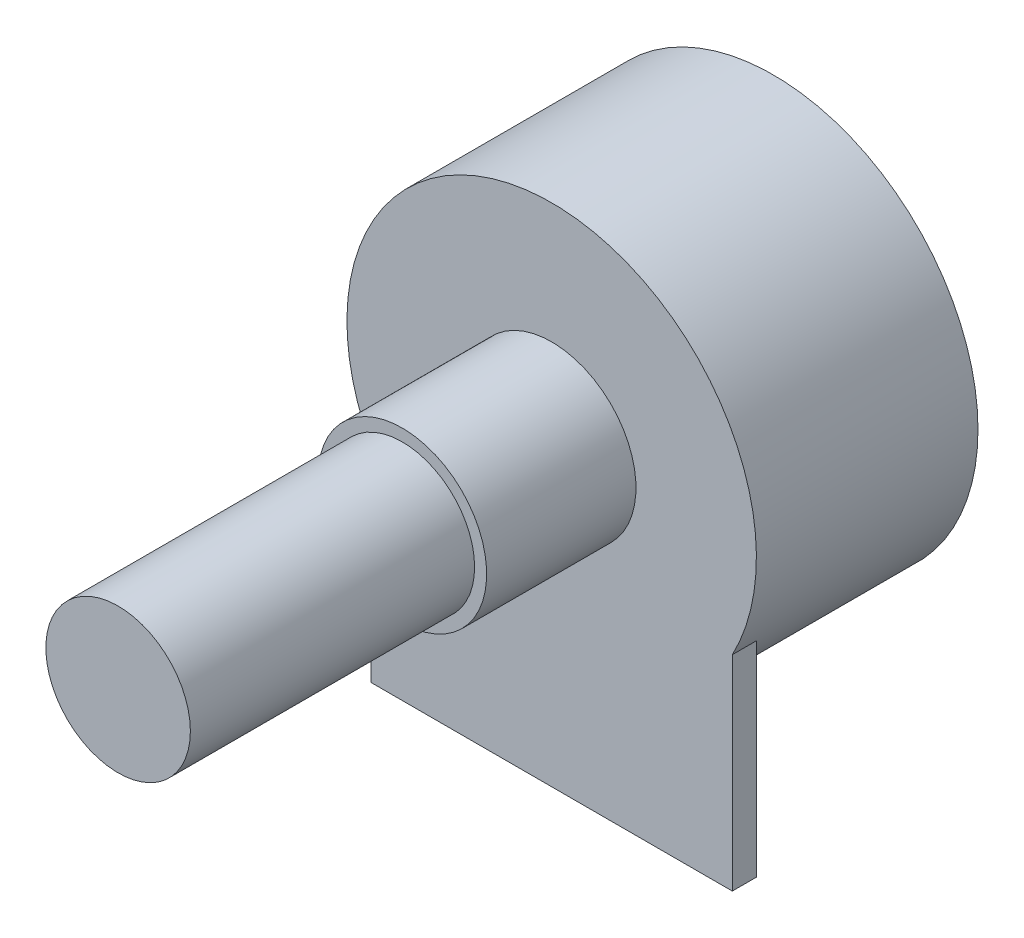
ISO-10303-21;
HEADER;
FILE_DESCRIPTION(('STEP AP214'),'2;1');
FILE_NAME('part.step','',(''),(''),'','','');
FILE_SCHEMA(('AUTOMOTIVE_DESIGN { 1 0 10303 214 1 1 1 1 }'));
ENDSEC;
DATA;
#1=APPLICATION_CONTEXT('core data for automotive mechanical design processes');
#2=APPLICATION_PROTOCOL_DEFINITION('international standard','automotive_design',2000,#1);
#3=PRODUCT_CONTEXT('',#1,'mechanical');
#4=PRODUCT('Part','Part','',(#3));
#5=PRODUCT_RELATED_PRODUCT_CATEGORY('part','',(#4));
#6=PRODUCT_DEFINITION_FORMATION('','',#4);
#7=PRODUCT_DEFINITION_CONTEXT('part definition',#1,'design');
#8=PRODUCT_DEFINITION('design','',#6,#7);
#9=PRODUCT_DEFINITION_SHAPE('','',#8);
#10=(LENGTH_UNIT() NAMED_UNIT(*) SI_UNIT(.MILLI.,.METRE.));
#11=(NAMED_UNIT(*) PLANE_ANGLE_UNIT() SI_UNIT($,.RADIAN.));
#12=(NAMED_UNIT(*) SI_UNIT($,.STERADIAN.) SOLID_ANGLE_UNIT());
#13=UNCERTAINTY_MEASURE_WITH_UNIT(LENGTH_MEASURE(1.E-05),#10,'distance_accuracy_value','');
#14=(GEOMETRIC_REPRESENTATION_CONTEXT(3) GLOBAL_UNCERTAINTY_ASSIGNED_CONTEXT((#13)) GLOBAL_UNIT_ASSIGNED_CONTEXT((#10,
#11,#12)) REPRESENTATION_CONTEXT('',''));
#15=CARTESIAN_POINT('',(0.,0.,0.));
#16=DIRECTION('',(0.,0.,1.));
#17=DIRECTION('',(1.,0.,0.));
#18=AXIS2_PLACEMENT_3D('',#15,#16,#17);
#19=CARTESIAN_POINT('',(0.,0.,9.2));
#20=DIRECTION('',(0.,0.,-1.));
#21=DIRECTION('',(-1.,0.,0.));
#22=AXIS2_PLACEMENT_3D('',#19,#20,#21);
#23=CYLINDRICAL_SURFACE('',#22,8.5);
#24=CARTESIAN_POINT('',(0.,0.,8.2));
#25=DIRECTION('',(0.,0.,1.));
#26=DIRECTION('',(1.,0.,0.));
#27=AXIS2_PLACEMENT_3D('',#24,#25,#26);
#28=CIRCLE('',#27,8.5);
#29=CARTESIAN_POINT('',(-7.5,-4.,8.2));
#30=VERTEX_POINT('',#29);
#31=CARTESIAN_POINT('',(7.5,-4.,8.2));
#32=VERTEX_POINT('',#31);
#33=EDGE_CURVE('E46',#30,#32,#28,.T.);
#34=ORIENTED_EDGE('',*,*,#33,.F.);
#35=DIRECTION('',(0.,0.,1.));
#36=VECTOR('',#35,1.);
#37=CARTESIAN_POINT('',(-7.5,-4.,8.2));
#38=LINE('',#37,#36);
#39=CARTESIAN_POINT('',(-7.5,-4.,9.2));
#40=VERTEX_POINT('',#39);
#41=EDGE_CURVE('E69',#30,#40,#38,.T.);
#42=ORIENTED_EDGE('',*,*,#41,.T.);
#43=CARTESIAN_POINT('',(0.,0.,9.2));
#44=DIRECTION('',(0.,0.,1.));
#45=DIRECTION('',(1.,0.,0.));
#46=AXIS2_PLACEMENT_3D('',#43,#44,#45);
#47=CIRCLE('',#46,8.5);
#48=CARTESIAN_POINT('',(7.5,-4.,9.2));
#49=VERTEX_POINT('',#48);
#50=EDGE_CURVE('E132',#49,#40,#47,.T.);
#51=ORIENTED_EDGE('',*,*,#50,.F.);
#52=DIRECTION('',(0.,0.,1.));
#53=VECTOR('',#52,1.);
#54=CARTESIAN_POINT('',(7.5,-4.,8.2));
#55=LINE('',#54,#53);
#56=EDGE_CURVE('E101',#32,#49,#55,.T.);
#57=ORIENTED_EDGE('',*,*,#56,.F.);
#58=EDGE_LOOP('',(#34,#42,#51,#57));
#59=FACE_BOUND('',#58,.T.);
#60=CARTESIAN_POINT('',(0.,0.,0.));
#61=DIRECTION('',(0.,0.,1.));
#62=DIRECTION('',(1.,0.,0.));
#63=AXIS2_PLACEMENT_3D('',#60,#61,#62);
#64=CIRCLE('',#63,8.5);
#65=CARTESIAN_POINT('',(8.5,0.,0.));
#66=VERTEX_POINT('',#65);
#67=EDGE_CURVE('E127',#66,#66,#64,.T.);
#68=ORIENTED_EDGE('',*,*,#67,.T.);
#69=EDGE_LOOP('',(#68));
#70=FACE_BOUND('',#69,.T.);
#71=ADVANCED_FACE('F43',(#59,#70),#23,.T.);
#72=CARTESIAN_POINT('',(0.,0.,9.2));
#73=DIRECTION('',(0.,0.,1.));
#74=DIRECTION('',(1.,0.,0.));
#75=AXIS2_PLACEMENT_3D('',#72,#73,#74);
#76=PLANE('',#75);
#77=CARTESIAN_POINT('',(0.,0.,9.2));
#78=DIRECTION('',(0.,0.,1.));
#79=DIRECTION('',(1.,0.,0.));
#80=AXIS2_PLACEMENT_3D('',#77,#78,#79);
#81=CIRCLE('',#80,3.5);
#82=CARTESIAN_POINT('',(-3.5,0.,9.2));
#83=VERTEX_POINT('',#82);
#84=EDGE_CURVE('E52',#83,#83,#81,.T.);
#85=ORIENTED_EDGE('',*,*,#84,.F.);
#86=EDGE_LOOP('',(#85));
#87=FACE_BOUND('',#86,.T.);
#88=ORIENTED_EDGE('',*,*,#50,.T.);
#89=DIRECTION('',(0.,-1.,0.));
#90=VECTOR('',#89,1.);
#91=CARTESIAN_POINT('',(-7.5,-4.,9.2));
#92=LINE('',#91,#90);
#93=CARTESIAN_POINT('',(-7.5,-12.5,9.2));
#94=VERTEX_POINT('',#93);
#95=EDGE_CURVE('E84',#40,#94,#92,.T.);
#96=ORIENTED_EDGE('',*,*,#95,.T.);
#97=DIRECTION('',(1.,0.,0.));
#98=VECTOR('',#97,1.);
#99=CARTESIAN_POINT('',(-7.5,-12.5,9.2));
#100=LINE('',#99,#98);
#101=CARTESIAN_POINT('',(7.5,-12.5,9.2));
#102=VERTEX_POINT('',#101);
#103=EDGE_CURVE('E119',#94,#102,#100,.T.);
#104=ORIENTED_EDGE('',*,*,#103,.T.);
#105=DIRECTION('',(0.,1.,0.));
#106=VECTOR('',#105,1.);
#107=CARTESIAN_POINT('',(7.5,-4.,9.2));
#108=LINE('',#107,#106);
#109=EDGE_CURVE('E60',#102,#49,#108,.T.);
#110=ORIENTED_EDGE('',*,*,#109,.T.);
#111=EDGE_LOOP('',(#88,#96,#104,#110));
#112=FACE_BOUND('',#111,.T.);
#113=ADVANCED_FACE('F142',(#87,#112),#76,.T.);
#114=CARTESIAN_POINT('',(0.,0.,0.));
#115=DIRECTION('',(0.,0.,1.));
#116=DIRECTION('',(1.,0.,0.));
#117=AXIS2_PLACEMENT_3D('',#114,#115,#116);
#118=PLANE('',#117);
#119=ORIENTED_EDGE('',*,*,#67,.F.);
#120=EDGE_LOOP('',(#119));
#121=FACE_BOUND('',#120,.T.);
#122=ADVANCED_FACE('F139',(#121),#118,.F.);
#123=CARTESIAN_POINT('',(-7.5,-4.,8.2));
#124=DIRECTION('',(-1.,0.,0.));
#125=DIRECTION('',(0.,-1.,0.));
#126=AXIS2_PLACEMENT_3D('',#123,#124,#125);
#127=PLANE('',#126);
#128=ORIENTED_EDGE('',*,*,#95,.F.);
#129=ORIENTED_EDGE('',*,*,#41,.F.);
#130=DIRECTION('',(0.,-1.,0.));
#131=VECTOR('',#130,1.);
#132=CARTESIAN_POINT('',(-7.5,-4.,8.2));
#133=LINE('',#132,#131);
#134=CARTESIAN_POINT('',(-7.5,-12.5,8.2));
#135=VERTEX_POINT('',#134);
#136=EDGE_CURVE('E111',#30,#135,#133,.T.);
#137=ORIENTED_EDGE('',*,*,#136,.T.);
#138=DIRECTION('',(0.,0.,1.));
#139=VECTOR('',#138,1.);
#140=CARTESIAN_POINT('',(-7.5,-12.5,8.2));
#141=LINE('',#140,#139);
#142=EDGE_CURVE('E90',#135,#94,#141,.T.);
#143=ORIENTED_EDGE('',*,*,#142,.T.);
#144=EDGE_LOOP('',(#128,#129,#137,#143));
#145=FACE_BOUND('',#144,.T.);
#146=ADVANCED_FACE('F141',(#145),#127,.T.);
#147=CARTESIAN_POINT('',(7.5,-4.,8.2));
#148=DIRECTION('',(1.,0.,0.));
#149=DIRECTION('',(0.,1.,0.));
#150=AXIS2_PLACEMENT_3D('',#147,#148,#149);
#151=PLANE('',#150);
#152=ORIENTED_EDGE('',*,*,#109,.F.);
#153=DIRECTION('',(0.,0.,1.));
#154=VECTOR('',#153,1.);
#155=CARTESIAN_POINT('',(7.5,-12.5,8.2));
#156=LINE('',#155,#154);
#157=CARTESIAN_POINT('',(7.5,-12.5,8.2));
#158=VERTEX_POINT('',#157);
#159=EDGE_CURVE('E95',#158,#102,#156,.T.);
#160=ORIENTED_EDGE('',*,*,#159,.F.);
#161=DIRECTION('',(0.,1.,0.));
#162=VECTOR('',#161,1.);
#163=CARTESIAN_POINT('',(7.5,-4.,8.2));
#164=LINE('',#163,#162);
#165=EDGE_CURVE('E98',#158,#32,#164,.T.);
#166=ORIENTED_EDGE('',*,*,#165,.T.);
#167=ORIENTED_EDGE('',*,*,#56,.T.);
#168=EDGE_LOOP('',(#152,#160,#166,#167));
#169=FACE_BOUND('',#168,.T.);
#170=ADVANCED_FACE('F97',(#169),#151,.T.);
#171=CARTESIAN_POINT('',(-7.5,-12.5,8.2));
#172=DIRECTION('',(0.,-1.,0.));
#173=DIRECTION('',(0.,0.,-1.));
#174=AXIS2_PLACEMENT_3D('',#171,#172,#173);
#175=PLANE('',#174);
#176=ORIENTED_EDGE('',*,*,#103,.F.);
#177=ORIENTED_EDGE('',*,*,#142,.F.);
#178=DIRECTION('',(1.,0.,0.));
#179=VECTOR('',#178,1.);
#180=CARTESIAN_POINT('',(-7.5,-12.5,8.2));
#181=LINE('',#180,#179);
#182=EDGE_CURVE('E105',#135,#158,#181,.T.);
#183=ORIENTED_EDGE('',*,*,#182,.T.);
#184=ORIENTED_EDGE('',*,*,#159,.T.);
#185=EDGE_LOOP('',(#176,#177,#183,#184));
#186=FACE_BOUND('',#185,.T.);
#187=ADVANCED_FACE('F109',(#186),#175,.T.);
#188=CARTESIAN_POINT('',(0.,0.,8.2));
#189=DIRECTION('',(0.,0.,1.));
#190=DIRECTION('',(1.,0.,0.));
#191=AXIS2_PLACEMENT_3D('',#188,#189,#190);
#192=PLANE('',#191);
#193=ORIENTED_EDGE('',*,*,#136,.F.);
#194=ORIENTED_EDGE('',*,*,#33,.T.);
#195=ORIENTED_EDGE('',*,*,#165,.F.);
#196=ORIENTED_EDGE('',*,*,#182,.F.);
#197=EDGE_LOOP('',(#193,#194,#195,#196));
#198=FACE_BOUND('',#197,.T.);
#199=ADVANCED_FACE('F104',(#198),#192,.F.);
#200=CARTESIAN_POINT('',(0.,0.,15.4));
#201=DIRECTION('',(0.,0.,-1.));
#202=DIRECTION('',(-1.,0.,0.));
#203=AXIS2_PLACEMENT_3D('',#200,#201,#202);
#204=CYLINDRICAL_SURFACE('',#203,3.5);
#205=CARTESIAN_POINT('',(0.,0.,15.4));
#206=DIRECTION('',(0.,0.,1.));
#207=DIRECTION('',(1.,0.,0.));
#208=AXIS2_PLACEMENT_3D('',#205,#206,#207);
#209=CIRCLE('',#208,3.5);
#210=CARTESIAN_POINT('',(-3.5,0.,15.4));
#211=VERTEX_POINT('',#210);
#212=EDGE_CURVE('E120',#211,#211,#209,.T.);
#213=CARTESIAN_POINT('',(-3.5,0.,15.4));
#214=CARTESIAN_POINT('',(-3.5,0.,15.3354166666667));
#215=CARTESIAN_POINT('',(-3.5,0.,15.2708333333333));
#216=CARTESIAN_POINT('',(-3.5,0.,15.1416666666667));
#217=CARTESIAN_POINT('',(-3.5,0.,15.0770833333333));
#218=CARTESIAN_POINT('',(-3.5,0.,14.9479166666667));
#219=CARTESIAN_POINT('',(-3.5,0.,14.8833333333333));
#220=CARTESIAN_POINT('',(-3.5,0.,14.7541666666667));
#221=CARTESIAN_POINT('',(-3.5,0.,14.6895833333333));
#222=CARTESIAN_POINT('',(-3.5,0.,14.5604166666667));
#223=CARTESIAN_POINT('',(-3.5,0.,14.4958333333333));
#224=CARTESIAN_POINT('',(-3.5,0.,14.3666666666667));
#225=CARTESIAN_POINT('',(-3.5,0.,14.3020833333333));
#226=CARTESIAN_POINT('',(-3.5,0.,14.1729166666667));
#227=CARTESIAN_POINT('',(-3.5,0.,14.1083333333333));
#228=CARTESIAN_POINT('',(-3.5,0.,13.9791666666667));
#229=CARTESIAN_POINT('',(-3.5,0.,13.9145833333333));
#230=CARTESIAN_POINT('',(-3.5,0.,13.7854166666667));
#231=CARTESIAN_POINT('',(-3.5,0.,13.7208333333333));
#232=CARTESIAN_POINT('',(-3.5,0.,13.5916666666667));
#233=CARTESIAN_POINT('',(-3.5,0.,13.5270833333333));
#234=CARTESIAN_POINT('',(-3.5,0.,13.3979166666667));
#235=CARTESIAN_POINT('',(-3.5,0.,13.3333333333333));
#236=CARTESIAN_POINT('',(-3.5,0.,13.2041666666667));
#237=CARTESIAN_POINT('',(-3.5,0.,13.1395833333333));
#238=CARTESIAN_POINT('',(-3.5,0.,13.0104166666667));
#239=CARTESIAN_POINT('',(-3.5,0.,12.9458333333333));
#240=CARTESIAN_POINT('',(-3.5,0.,12.8166666666667));
#241=CARTESIAN_POINT('',(-3.5,0.,12.7520833333333));
#242=CARTESIAN_POINT('',(-3.5,0.,12.6229166666667));
#243=CARTESIAN_POINT('',(-3.5,0.,12.5583333333333));
#244=CARTESIAN_POINT('',(-3.5,0.,12.4291666666667));
#245=CARTESIAN_POINT('',(-3.5,0.,12.3645833333333));
#246=CARTESIAN_POINT('',(-3.5,0.,12.2354166666667));
#247=CARTESIAN_POINT('',(-3.5,0.,12.1708333333333));
#248=CARTESIAN_POINT('',(-3.5,0.,12.0416666666667));
#249=CARTESIAN_POINT('',(-3.5,0.,11.9770833333333));
#250=CARTESIAN_POINT('',(-3.5,0.,11.8479166666667));
#251=CARTESIAN_POINT('',(-3.5,0.,11.7833333333333));
#252=CARTESIAN_POINT('',(-3.5,0.,11.6541666666667));
#253=CARTESIAN_POINT('',(-3.5,0.,11.5895833333333));
#254=CARTESIAN_POINT('',(-3.5,0.,11.4604166666667));
#255=CARTESIAN_POINT('',(-3.5,0.,11.3958333333333));
#256=CARTESIAN_POINT('',(-3.5,0.,11.2666666666667));
#257=CARTESIAN_POINT('',(-3.5,0.,11.2020833333333));
#258=CARTESIAN_POINT('',(-3.5,0.,11.0729166666667));
#259=CARTESIAN_POINT('',(-3.5,0.,11.0083333333333));
#260=CARTESIAN_POINT('',(-3.5,0.,10.8791666666667));
#261=CARTESIAN_POINT('',(-3.5,0.,10.8145833333333));
#262=CARTESIAN_POINT('',(-3.5,0.,10.6854166666667));
#263=CARTESIAN_POINT('',(-3.5,0.,10.6208333333333));
#264=CARTESIAN_POINT('',(-3.5,0.,10.4916666666667));
#265=CARTESIAN_POINT('',(-3.5,0.,10.4270833333333));
#266=CARTESIAN_POINT('',(-3.5,0.,10.2979166666667));
#267=CARTESIAN_POINT('',(-3.5,0.,10.2333333333333));
#268=CARTESIAN_POINT('',(-3.5,0.,10.1041666666667));
#269=CARTESIAN_POINT('',(-3.5,0.,10.0395833333333));
#270=CARTESIAN_POINT('',(-3.5,0.,9.91041666666667));
#271=CARTESIAN_POINT('',(-3.5,0.,9.84583333333333));
#272=CARTESIAN_POINT('',(-3.5,0.,9.71666666666667));
#273=CARTESIAN_POINT('',(-3.5,0.,9.65208333333333));
#274=CARTESIAN_POINT('',(-3.5,0.,9.52291666666667));
#275=CARTESIAN_POINT('',(-3.5,0.,9.45833333333333));
#276=CARTESIAN_POINT('',(-3.5,0.,9.32916666666667));
#277=CARTESIAN_POINT('',(-3.5,0.,9.26458333333333));
#278=CARTESIAN_POINT('',(-3.5,0.,9.2));
#279=B_SPLINE_CURVE_WITH_KNOTS('',3,(#213,#214,#215,#216,#217,#218,#219,#220,#221,#222,#223,
#224,#225,#226,#227,#228,#229,#230,#231,#232,#233,#234,#235,#236,#237,#238,#239,#240,#241,#242,
#243,#244,#245,#246,#247,#248,#249,#250,#251,#252,#253,#254,#255,#256,#257,#258,#259,#260,#261,
#262,#263,#264,#265,#266,#267,#268,#269,#270,#271,#272,#273,#274,#275,#276,#277,#278),
.UNSPECIFIED.,.F.,.F.,(4,2,2,2,2,2,2,2,2,2,2,2,2,2,2,2,2,2,2,2,2,2,2,2,2,2,2,2,2,2,2,2,4),(0.,
0.193750000000001,0.387500000000001,0.58125,0.775000000000001,0.968750000000001,1.1625,1.35625,
1.55,1.74375,1.9375,2.13125,2.325,2.51875,2.7125,2.90625,3.1,3.29375,3.4875,3.68125,3.875,
4.06875,4.2625,4.45625,4.65,4.84375,5.0375,5.23125,5.425,5.61875,5.8125,6.00625,6.2),.UNSPECIFIED.);
#280=EDGE_CURVE('BSEAM180',#211,#83,#279,.T.);
#281=ORIENTED_EDGE('',*,*,#212,.F.);
#282=ORIENTED_EDGE('',*,*,#84,.T.);
#283=ORIENTED_EDGE('',*,*,#280,.T.);
#284=ORIENTED_EDGE('',*,*,#280,.F.);
#285=EDGE_LOOP('',(#281,#283,#282,#284));
#286=FACE_BOUND('',#285,.T.);
#287=ADVANCED_FACE('F180',(#286),#204,.T.);
#288=CARTESIAN_POINT('',(0.,0.,15.4));
#289=DIRECTION('',(0.,0.,1.));
#290=DIRECTION('',(1.,0.,0.));
#291=AXIS2_PLACEMENT_3D('',#288,#289,#290);
#292=PLANE('',#291);
#293=CARTESIAN_POINT('',(0.,0.,15.4));
#294=DIRECTION('',(0.,0.,1.));
#295=DIRECTION('',(1.,0.,0.));
#296=AXIS2_PLACEMENT_3D('',#293,#294,#295);
#297=CIRCLE('',#296,3.);
#298=CARTESIAN_POINT('',(3.,0.,15.4));
#299=VERTEX_POINT('',#298);
#300=EDGE_CURVE('E11',#299,#299,#297,.T.);
#301=ORIENTED_EDGE('',*,*,#300,.F.);
#302=EDGE_LOOP('',(#301));
#303=FACE_BOUND('',#302,.T.);
#304=ORIENTED_EDGE('',*,*,#212,.T.);
#305=EDGE_LOOP('',(#304));
#306=FACE_BOUND('',#305,.T.);
#307=ADVANCED_FACE('F174',(#303,#306),#292,.T.);
#308=CARTESIAN_POINT('',(0.,0.,27.2));
#309=DIRECTION('',(0.,0.,-1.));
#310=DIRECTION('',(-1.,0.,0.));
#311=AXIS2_PLACEMENT_3D('',#308,#309,#310);
#312=CYLINDRICAL_SURFACE('',#311,3.);
#313=CARTESIAN_POINT('',(0.,0.,27.2));
#314=DIRECTION('',(0.,0.,1.));
#315=DIRECTION('',(1.,0.,0.));
#316=AXIS2_PLACEMENT_3D('',#313,#314,#315);
#317=CIRCLE('',#316,3.);
#318=CARTESIAN_POINT('',(3.,0.,27.2));
#319=VERTEX_POINT('',#318);
#320=EDGE_CURVE('E163',#319,#319,#317,.T.);
#321=ORIENTED_EDGE('',*,*,#320,.F.);
#322=EDGE_LOOP('',(#321));
#323=FACE_BOUND('',#322,.T.);
#324=ORIENTED_EDGE('',*,*,#300,.T.);
#325=EDGE_LOOP('',(#324));
#326=FACE_BOUND('',#325,.T.);
#327=ADVANCED_FACE('F171',(#323,#326),#312,.T.);
#328=CARTESIAN_POINT('',(0.,0.,27.2));
#329=DIRECTION('',(0.,0.,1.));
#330=DIRECTION('',(1.,0.,0.));
#331=AXIS2_PLACEMENT_3D('',#328,#329,#330);
#332=PLANE('',#331);
#333=ORIENTED_EDGE('',*,*,#320,.T.);
#334=EDGE_LOOP('',(#333));
#335=FACE_BOUND('',#334,.T.);
#336=ADVANCED_FACE('F169',(#335),#332,.T.);
#337=CLOSED_SHELL('',(#71,#113,#122,#146,#170,#187,#199,#287,#307,#327,#336));
#338=MANIFOLD_SOLID_BREP('B2',#337);
#339=ADVANCED_BREP_SHAPE_REPRESENTATION('',(#18,#338),#14);
#340=SHAPE_DEFINITION_REPRESENTATION(#9,#339);
ENDSEC;
END-ISO-10303-21;
